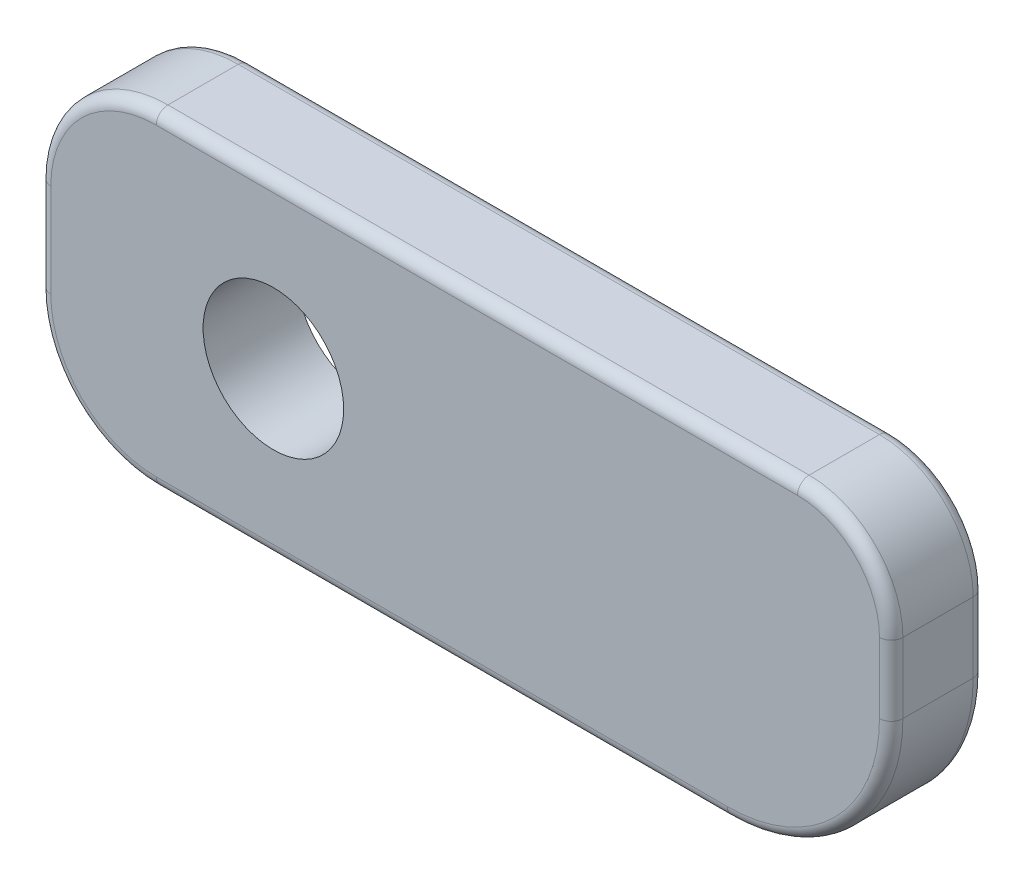
ISO-10303-21;
HEADER;
FILE_DESCRIPTION(('STEP AP214'),'2;1');
FILE_NAME('part.step','',(''),(''),'','','');
FILE_SCHEMA(('AUTOMOTIVE_DESIGN { 1 0 10303 214 1 1 1 1 }'));
ENDSEC;
DATA;
#1=APPLICATION_CONTEXT('core data for automotive mechanical design processes');
#2=APPLICATION_PROTOCOL_DEFINITION('international standard','automotive_design',2000,#1);
#3=PRODUCT_CONTEXT('',#1,'mechanical');
#4=PRODUCT('Part','Part','',(#3));
#5=PRODUCT_RELATED_PRODUCT_CATEGORY('part','',(#4));
#6=PRODUCT_DEFINITION_FORMATION('','',#4);
#7=PRODUCT_DEFINITION_CONTEXT('part definition',#1,'design');
#8=PRODUCT_DEFINITION('design','',#6,#7);
#9=PRODUCT_DEFINITION_SHAPE('','',#8);
#10=(LENGTH_UNIT() NAMED_UNIT(*) SI_UNIT(.MILLI.,.METRE.));
#11=(NAMED_UNIT(*) PLANE_ANGLE_UNIT() SI_UNIT($,.RADIAN.));
#12=(NAMED_UNIT(*) SI_UNIT($,.STERADIAN.) SOLID_ANGLE_UNIT());
#13=UNCERTAINTY_MEASURE_WITH_UNIT(LENGTH_MEASURE(1.E-05),#10,'distance_accuracy_value','');
#14=(GEOMETRIC_REPRESENTATION_CONTEXT(3) GLOBAL_UNCERTAINTY_ASSIGNED_CONTEXT((#13)) GLOBAL_UNIT_ASSIGNED_CONTEXT((#10,
#11,#12)) REPRESENTATION_CONTEXT('',''));
#15=CARTESIAN_POINT('',(0.,0.,0.));
#16=DIRECTION('',(0.,0.,1.));
#17=DIRECTION('',(1.,0.,0.));
#18=AXIS2_PLACEMENT_3D('',#15,#16,#17);
#19=CARTESIAN_POINT('',(0.,0.,10.16));
#20=DIRECTION('',(0.,0.,-1.));
#21=DIRECTION('',(-1.,0.,0.));
#22=AXIS2_PLACEMENT_3D('',#19,#20,#21);
#23=PLANE('',#22);
#24=CARTESIAN_POINT('',(25.4,17.78,10.16));
#25=DIRECTION('',(0.,0.,1.));
#26=DIRECTION('',(1.,0.,0.));
#27=AXIS2_PLACEMENT_3D('',#24,#25,#26);
#28=CIRCLE('',#27,7.62);
#29=CARTESIAN_POINT('',(33.02,17.78,10.16));
#30=VERTEX_POINT('',#29);
#31=EDGE_CURVE('E343',#30,#30,#28,.T.);
#32=ORIENTED_EDGE('',*,*,#31,.F.);
#33=EDGE_LOOP('',(#32));
#34=FACE_BOUND('',#33,.T.);
#35=CARTESIAN_POINT('',(12.7,12.7,10.16));
#36=DIRECTION('',(0.,0.,-1.));
#37=DIRECTION('',(-1.,0.,0.));
#38=AXIS2_PLACEMENT_3D('',#35,#36,#37);
#39=CIRCLE('',#38,11.43);
#40=CARTESIAN_POINT('',(12.7,1.27,10.16));
#41=VERTEX_POINT('',#40);
#42=CARTESIAN_POINT('',(1.27,12.7,10.16));
#43=VERTEX_POINT('',#42);
#44=EDGE_CURVE('E264',#41,#43,#39,.T.);
#45=ORIENTED_EDGE('',*,*,#44,.F.);
#46=DIRECTION('',(1.,0.,0.));
#47=VECTOR('',#46,1.);
#48=CARTESIAN_POINT('',(0.,1.27,10.16));
#49=LINE('',#48,#47);
#50=CARTESIAN_POINT('',(74.5998,1.27,10.16));
#51=VERTEX_POINT('',#50);
#52=EDGE_CURVE('E294',#41,#51,#49,.T.);
#53=ORIENTED_EDGE('',*,*,#52,.T.);
#54=CARTESIAN_POINT('',(74.5998,17.78,10.16));
#55=DIRECTION('',(0.,0.,-1.));
#56=DIRECTION('',(-1.,0.,0.));
#57=AXIS2_PLACEMENT_3D('',#54,#55,#56);
#58=CIRCLE('',#57,16.51);
#59=CARTESIAN_POINT('',(91.1098,17.78,10.16));
#60=VERTEX_POINT('',#59);
#61=EDGE_CURVE('E179',#60,#51,#58,.T.);
#62=ORIENTED_EDGE('',*,*,#61,.F.);
#63=DIRECTION('',(0.,1.,0.));
#64=VECTOR('',#63,1.);
#65=CARTESIAN_POINT('',(91.1098,0.,10.16));
#66=LINE('',#65,#64);
#67=CARTESIAN_POINT('',(91.1098,25.4,10.16));
#68=VERTEX_POINT('',#67);
#69=EDGE_CURVE('E298',#60,#68,#66,.T.);
#70=ORIENTED_EDGE('',*,*,#69,.T.);
#71=CARTESIAN_POINT('',(82.2198,25.4,10.16));
#72=DIRECTION('',(0.,0.,-1.));
#73=DIRECTION('',(-1.,0.,0.));
#74=AXIS2_PLACEMENT_3D('',#71,#72,#73);
#75=CIRCLE('',#74,8.89);
#76=CARTESIAN_POINT('',(82.2198,34.29,10.16));
#77=VERTEX_POINT('',#76);
#78=EDGE_CURVE('E216',#77,#68,#75,.T.);
#79=ORIENTED_EDGE('',*,*,#78,.F.);
#80=DIRECTION('',(-1.,0.,0.));
#81=VECTOR('',#80,1.);
#82=CARTESIAN_POINT('',(0.,34.29,10.16));
#83=LINE('',#82,#81);
#84=CARTESIAN_POINT('',(12.7,34.29,10.16));
#85=VERTEX_POINT('',#84);
#86=EDGE_CURVE('E340',#77,#85,#83,.T.);
#87=ORIENTED_EDGE('',*,*,#86,.T.);
#88=CARTESIAN_POINT('',(12.7,22.86,10.16));
#89=DIRECTION('',(0.,0.,-1.));
#90=DIRECTION('',(-1.,0.,0.));
#91=AXIS2_PLACEMENT_3D('',#88,#89,#90);
#92=CIRCLE('',#91,11.43);
#93=CARTESIAN_POINT('',(1.27,22.86,10.16));
#94=VERTEX_POINT('',#93);
#95=EDGE_CURVE('E242',#94,#85,#92,.T.);
#96=ORIENTED_EDGE('',*,*,#95,.F.);
#97=DIRECTION('',(0.,-1.,0.));
#98=VECTOR('',#97,1.);
#99=CARTESIAN_POINT('',(1.27,0.,10.16));
#100=LINE('',#99,#98);
#101=EDGE_CURVE('E289',#94,#43,#100,.T.);
#102=ORIENTED_EDGE('',*,*,#101,.T.);
#103=EDGE_LOOP('',(#45,#53,#62,#70,#79,#87,#96,#102));
#104=FACE_BOUND('',#103,.T.);
#105=ADVANCED_FACE('F38',(#34,#104),#23,.F.);
#106=CARTESIAN_POINT('',(0.,0.,0.));
#107=DIRECTION('',(0.,0.,-1.));
#108=DIRECTION('',(-1.,0.,0.));
#109=AXIS2_PLACEMENT_3D('',#106,#107,#108);
#110=PLANE('',#109);
#111=CARTESIAN_POINT('',(25.4,17.78,0.));
#112=DIRECTION('',(0.,0.,1.));
#113=DIRECTION('',(1.,0.,0.));
#114=AXIS2_PLACEMENT_3D('',#111,#112,#113);
#115=CIRCLE('',#114,7.62);
#116=CARTESIAN_POINT('',(33.02,17.78,0.));
#117=VERTEX_POINT('',#116);
#118=EDGE_CURVE('E210',#117,#117,#115,.T.);
#119=ORIENTED_EDGE('',*,*,#118,.T.);
#120=EDGE_LOOP('',(#119));
#121=FACE_BOUND('',#120,.T.);
#122=CARTESIAN_POINT('',(12.7,12.7,0.));
#123=DIRECTION('',(0.,0.,-1.));
#124=DIRECTION('',(-1.,0.,0.));
#125=AXIS2_PLACEMENT_3D('',#122,#123,#124);
#126=CIRCLE('',#125,11.43);
#127=CARTESIAN_POINT('',(1.27,12.7,0.));
#128=VERTEX_POINT('',#127);
#129=CARTESIAN_POINT('',(12.7,1.27,0.));
#130=VERTEX_POINT('',#129);
#131=EDGE_CURVE('E254',#128,#130,#126,.F.);
#132=ORIENTED_EDGE('',*,*,#131,.F.);
#133=DIRECTION('',(0.,-1.,0.));
#134=VECTOR('',#133,1.);
#135=CARTESIAN_POINT('',(1.27,35.56,0.));
#136=LINE('',#135,#134);
#137=CARTESIAN_POINT('',(1.27,22.86,0.));
#138=VERTEX_POINT('',#137);
#139=EDGE_CURVE('E308',#128,#138,#136,.F.);
#140=ORIENTED_EDGE('',*,*,#139,.T.);
#141=CARTESIAN_POINT('',(12.7,22.86,0.));
#142=DIRECTION('',(0.,0.,-1.));
#143=DIRECTION('',(-1.,0.,0.));
#144=AXIS2_PLACEMENT_3D('',#141,#142,#143);
#145=CIRCLE('',#144,11.43);
#146=CARTESIAN_POINT('',(12.7,34.29,0.));
#147=VERTEX_POINT('',#146);
#148=EDGE_CURVE('E237',#147,#138,#145,.F.);
#149=ORIENTED_EDGE('',*,*,#148,.F.);
#150=DIRECTION('',(-1.,0.,0.));
#151=VECTOR('',#150,1.);
#152=CARTESIAN_POINT('',(92.3798,34.29,0.));
#153=LINE('',#152,#151);
#154=CARTESIAN_POINT('',(82.2198,34.29,0.));
#155=VERTEX_POINT('',#154);
#156=EDGE_CURVE('E310',#147,#155,#153,.F.);
#157=ORIENTED_EDGE('',*,*,#156,.T.);
#158=CARTESIAN_POINT('',(82.2198,25.4,0.));
#159=DIRECTION('',(0.,0.,-1.));
#160=DIRECTION('',(-1.,0.,0.));
#161=AXIS2_PLACEMENT_3D('',#158,#159,#160);
#162=CIRCLE('',#161,8.89);
#163=CARTESIAN_POINT('',(91.1098,25.4,0.));
#164=VERTEX_POINT('',#163);
#165=EDGE_CURVE('E164',#164,#155,#162,.F.);
#166=ORIENTED_EDGE('',*,*,#165,.F.);
#167=DIRECTION('',(0.,1.,0.));
#168=VECTOR('',#167,1.);
#169=CARTESIAN_POINT('',(91.1098,0.,0.));
#170=LINE('',#169,#168);
#171=CARTESIAN_POINT('',(91.1098,17.78,0.));
#172=VERTEX_POINT('',#171);
#173=EDGE_CURVE('E155',#164,#172,#170,.F.);
#174=ORIENTED_EDGE('',*,*,#173,.T.);
#175=CARTESIAN_POINT('',(74.5998,17.78,0.));
#176=DIRECTION('',(0.,0.,-1.));
#177=DIRECTION('',(-1.,0.,0.));
#178=AXIS2_PLACEMENT_3D('',#175,#176,#177);
#179=CIRCLE('',#178,16.51);
#180=CARTESIAN_POINT('',(74.5998,1.27,0.));
#181=VERTEX_POINT('',#180);
#182=EDGE_CURVE('E161',#181,#172,#179,.F.);
#183=ORIENTED_EDGE('',*,*,#182,.F.);
#184=DIRECTION('',(1.,0.,0.));
#185=VECTOR('',#184,1.);
#186=CARTESIAN_POINT('',(0.,1.27,0.));
#187=LINE('',#186,#185);
#188=EDGE_CURVE('E168',#181,#130,#187,.F.);
#189=ORIENTED_EDGE('',*,*,#188,.T.);
#190=EDGE_LOOP('',(#132,#140,#149,#157,#166,#174,#183,#189));
#191=FACE_BOUND('',#190,.T.);
#192=ADVANCED_FACE('F158',(#121,#191),#110,.T.);
#193=CARTESIAN_POINT('',(92.3798,0.,10.16));
#194=DIRECTION('',(0.,1.,0.));
#195=DIRECTION('',(0.,0.,1.));
#196=AXIS2_PLACEMENT_3D('',#193,#194,#195);
#197=PLANE('',#196);
#198=DIRECTION('',(1.,0.,0.));
#199=VECTOR('',#198,1.);
#200=CARTESIAN_POINT('',(92.3798,0.,8.89));
#201=LINE('',#200,#199);
#202=CARTESIAN_POINT('',(74.5998,0.,8.89));
#203=VERTEX_POINT('',#202);
#204=CARTESIAN_POINT('',(12.7,0.,8.89));
#205=VERTEX_POINT('',#204);
#206=EDGE_CURVE('E296',#203,#205,#201,.F.);
#207=ORIENTED_EDGE('',*,*,#206,.T.);
#208=DIRECTION('',(0.,0.,-1.));
#209=VECTOR('',#208,1.);
#210=CARTESIAN_POINT('',(12.7,0.,10.16));
#211=LINE('',#210,#209);
#212=CARTESIAN_POINT('',(12.7,0.,1.27));
#213=VERTEX_POINT('',#212);
#214=EDGE_CURVE('E47',#205,#213,#211,.T.);
#215=ORIENTED_EDGE('',*,*,#214,.T.);
#216=DIRECTION('',(1.,0.,0.));
#217=VECTOR('',#216,1.);
#218=CARTESIAN_POINT('',(92.3798,0.,1.27));
#219=LINE('',#218,#217);
#220=CARTESIAN_POINT('',(74.5998,0.,1.27));
#221=VERTEX_POINT('',#220);
#222=EDGE_CURVE('E167',#213,#221,#219,.T.);
#223=ORIENTED_EDGE('',*,*,#222,.T.);
#224=DIRECTION('',(0.,0.,-1.));
#225=VECTOR('',#224,1.);
#226=CARTESIAN_POINT('',(74.5998,0.,10.16));
#227=LINE('',#226,#225);
#228=EDGE_CURVE('E201',#221,#203,#227,.F.);
#229=ORIENTED_EDGE('',*,*,#228,.T.);
#230=EDGE_LOOP('',(#207,#215,#223,#229));
#231=FACE_BOUND('',#230,.T.);
#232=ADVANCED_FACE('F370',(#231),#197,.F.);
#233=CARTESIAN_POINT('',(92.3798,35.56,10.16));
#234=DIRECTION('',(-1.,0.,0.));
#235=DIRECTION('',(0.,0.,1.));
#236=AXIS2_PLACEMENT_3D('',#233,#234,#235);
#237=PLANE('',#236);
#238=DIRECTION('',(0.,1.,0.));
#239=VECTOR('',#238,1.);
#240=CARTESIAN_POINT('',(92.3798,35.56,1.27));
#241=LINE('',#240,#239);
#242=CARTESIAN_POINT('',(92.3798,17.78,1.27));
#243=VERTEX_POINT('',#242);
#244=CARTESIAN_POINT('',(92.3798,25.4,1.27));
#245=VERTEX_POINT('',#244);
#246=EDGE_CURVE('E175',#243,#245,#241,.T.);
#247=ORIENTED_EDGE('',*,*,#246,.T.);
#248=DIRECTION('',(0.,0.,-1.));
#249=VECTOR('',#248,1.);
#250=CARTESIAN_POINT('',(92.3798,25.4,10.16));
#251=LINE('',#250,#249);
#252=CARTESIAN_POINT('',(92.3798,25.4,8.89));
#253=VERTEX_POINT('',#252);
#254=EDGE_CURVE('E226',#245,#253,#251,.F.);
#255=ORIENTED_EDGE('',*,*,#254,.T.);
#256=DIRECTION('',(0.,1.,0.));
#257=VECTOR('',#256,1.);
#258=CARTESIAN_POINT('',(92.3798,35.56,8.89));
#259=LINE('',#258,#257);
#260=CARTESIAN_POINT('',(92.3798,17.78,8.89));
#261=VERTEX_POINT('',#260);
#262=EDGE_CURVE('E303',#253,#261,#259,.F.);
#263=ORIENTED_EDGE('',*,*,#262,.T.);
#264=DIRECTION('',(0.,0.,-1.));
#265=VECTOR('',#264,1.);
#266=CARTESIAN_POINT('',(92.3798,17.78,10.16));
#267=LINE('',#266,#265);
#268=EDGE_CURVE('E199',#261,#243,#267,.T.);
#269=ORIENTED_EDGE('',*,*,#268,.T.);
#270=EDGE_LOOP('',(#247,#255,#263,#269));
#271=FACE_BOUND('',#270,.T.);
#272=ADVANCED_FACE('F376',(#271),#237,.F.);
#273=CARTESIAN_POINT('',(0.,35.56,10.16));
#274=DIRECTION('',(0.,-1.,0.));
#275=DIRECTION('',(0.,0.,-1.));
#276=AXIS2_PLACEMENT_3D('',#273,#274,#275);
#277=PLANE('',#276);
#278=DIRECTION('',(-1.,0.,0.));
#279=VECTOR('',#278,1.);
#280=CARTESIAN_POINT('',(0.,35.56,1.27));
#281=LINE('',#280,#279);
#282=CARTESIAN_POINT('',(82.2198,35.56,1.27));
#283=VERTEX_POINT('',#282);
#284=CARTESIAN_POINT('',(12.7,35.56,1.27));
#285=VERTEX_POINT('',#284);
#286=EDGE_CURVE('E186',#283,#285,#281,.T.);
#287=ORIENTED_EDGE('',*,*,#286,.T.);
#288=DIRECTION('',(0.,0.,-1.));
#289=VECTOR('',#288,1.);
#290=CARTESIAN_POINT('',(12.7,35.56,10.16));
#291=LINE('',#290,#289);
#292=CARTESIAN_POINT('',(12.7,35.56,8.89));
#293=VERTEX_POINT('',#292);
#294=EDGE_CURVE('E252',#285,#293,#291,.F.);
#295=ORIENTED_EDGE('',*,*,#294,.T.);
#296=DIRECTION('',(-1.,0.,0.));
#297=VECTOR('',#296,1.);
#298=CARTESIAN_POINT('',(0.,35.56,8.89));
#299=LINE('',#298,#297);
#300=CARTESIAN_POINT('',(82.2198,35.56,8.89));
#301=VERTEX_POINT('',#300);
#302=EDGE_CURVE('E305',#293,#301,#299,.F.);
#303=ORIENTED_EDGE('',*,*,#302,.T.);
#304=DIRECTION('',(0.,0.,-1.));
#305=VECTOR('',#304,1.);
#306=CARTESIAN_POINT('',(82.2198,35.56,10.16));
#307=LINE('',#306,#305);
#308=EDGE_CURVE('E224',#301,#283,#307,.T.);
#309=ORIENTED_EDGE('',*,*,#308,.T.);
#310=EDGE_LOOP('',(#287,#295,#303,#309));
#311=FACE_BOUND('',#310,.T.);
#312=ADVANCED_FACE('F317',(#311),#277,.F.);
#313=CARTESIAN_POINT('',(0.,0.,10.16));
#314=DIRECTION('',(1.,0.,0.));
#315=DIRECTION('',(0.,0.,-1.));
#316=AXIS2_PLACEMENT_3D('',#313,#314,#315);
#317=PLANE('',#316);
#318=DIRECTION('',(0.,-1.,0.));
#319=VECTOR('',#318,1.);
#320=CARTESIAN_POINT('',(0.,0.,1.27));
#321=LINE('',#320,#319);
#322=CARTESIAN_POINT('',(0.,22.86,1.27));
#323=VERTEX_POINT('',#322);
#324=CARTESIAN_POINT('',(0.,12.7,1.27));
#325=VERTEX_POINT('',#324);
#326=EDGE_CURVE('E184',#323,#325,#321,.T.);
#327=ORIENTED_EDGE('',*,*,#326,.T.);
#328=DIRECTION('',(0.,0.,-1.));
#329=VECTOR('',#328,1.);
#330=CARTESIAN_POINT('',(0.,12.7,10.16));
#331=LINE('',#330,#329);
#332=CARTESIAN_POINT('',(0.,12.7,8.89));
#333=VERTEX_POINT('',#332);
#334=EDGE_CURVE('E11',#325,#333,#331,.F.);
#335=ORIENTED_EDGE('',*,*,#334,.T.);
#336=DIRECTION('',(0.,-1.,0.));
#337=VECTOR('',#336,1.);
#338=CARTESIAN_POINT('',(0.,0.,8.89));
#339=LINE('',#338,#337);
#340=CARTESIAN_POINT('',(0.,22.86,8.89));
#341=VERTEX_POINT('',#340);
#342=EDGE_CURVE('E291',#333,#341,#339,.F.);
#343=ORIENTED_EDGE('',*,*,#342,.T.);
#344=DIRECTION('',(0.,0.,-1.));
#345=VECTOR('',#344,1.);
#346=CARTESIAN_POINT('',(0.,22.86,10.16));
#347=LINE('',#346,#345);
#348=EDGE_CURVE('E250',#341,#323,#347,.T.);
#349=ORIENTED_EDGE('',*,*,#348,.T.);
#350=EDGE_LOOP('',(#327,#335,#343,#349));
#351=FACE_BOUND('',#350,.T.);
#352=ADVANCED_FACE('F333',(#351),#317,.F.);
#353=CARTESIAN_POINT('',(25.4,17.78,10.16));
#354=DIRECTION('',(0.,0.,-1.));
#355=DIRECTION('',(-1.,0.,0.));
#356=AXIS2_PLACEMENT_3D('',#353,#354,#355);
#357=CYLINDRICAL_SURFACE('',#356,7.62);
#358=ORIENTED_EDGE('',*,*,#31,.T.);
#359=EDGE_LOOP('',(#358));
#360=FACE_BOUND('',#359,.T.);
#361=ORIENTED_EDGE('',*,*,#118,.F.);
#362=EDGE_LOOP('',(#361));
#363=FACE_BOUND('',#362,.T.);
#364=ADVANCED_FACE('F352',(#360,#363),#357,.F.);
#365=CARTESIAN_POINT('',(91.1098,0.,8.89));
#366=DIRECTION('',(0.,1.,0.));
#367=DIRECTION('',(0.,0.,1.));
#368=AXIS2_PLACEMENT_3D('',#365,#366,#367);
#369=CYLINDRICAL_SURFACE('',#368,1.27);
#370=ORIENTED_EDGE('',*,*,#262,.F.);
#371=CARTESIAN_POINT('',(91.1098,25.4,8.89));
#372=DIRECTION('',(0.,-1.,0.));
#373=DIRECTION('',(0.,0.,-1.));
#374=AXIS2_PLACEMENT_3D('',#371,#372,#373);
#375=CIRCLE('',#374,1.27);
#376=EDGE_CURVE('E214',#253,#68,#375,.T.);
#377=ORIENTED_EDGE('',*,*,#376,.T.);
#378=ORIENTED_EDGE('',*,*,#69,.F.);
#379=CARTESIAN_POINT('',(91.1098,17.78,8.89));
#380=DIRECTION('',(0.,1.,0.));
#381=DIRECTION('',(0.,0.,1.));
#382=AXIS2_PLACEMENT_3D('',#379,#380,#381);
#383=CIRCLE('',#382,1.27);
#384=EDGE_CURVE('E195',#60,#261,#383,.T.);
#385=ORIENTED_EDGE('',*,*,#384,.T.);
#386=EDGE_LOOP('',(#370,#377,#378,#385));
#387=FACE_BOUND('',#386,.T.);
#388=ADVANCED_FACE('F354',(#387),#369,.T.);
#389=CARTESIAN_POINT('',(0.,34.29,8.89));
#390=DIRECTION('',(-1.,0.,0.));
#391=DIRECTION('',(0.,0.,1.));
#392=AXIS2_PLACEMENT_3D('',#389,#390,#391);
#393=CYLINDRICAL_SURFACE('',#392,1.27);
#394=ORIENTED_EDGE('',*,*,#302,.F.);
#395=CARTESIAN_POINT('',(12.7,34.29,8.89));
#396=DIRECTION('',(1.,0.,0.));
#397=DIRECTION('',(0.,0.,-1.));
#398=AXIS2_PLACEMENT_3D('',#395,#396,#397);
#399=CIRCLE('',#398,1.27);
#400=EDGE_CURVE('E240',#293,#85,#399,.T.);
#401=ORIENTED_EDGE('',*,*,#400,.T.);
#402=ORIENTED_EDGE('',*,*,#86,.F.);
#403=CARTESIAN_POINT('',(82.2198,34.29,8.89));
#404=DIRECTION('',(-1.,0.,0.));
#405=DIRECTION('',(0.,0.,1.));
#406=AXIS2_PLACEMENT_3D('',#403,#404,#405);
#407=CIRCLE('',#406,1.27);
#408=EDGE_CURVE('E219',#77,#301,#407,.T.);
#409=ORIENTED_EDGE('',*,*,#408,.T.);
#410=EDGE_LOOP('',(#394,#401,#402,#409));
#411=FACE_BOUND('',#410,.T.);
#412=ADVANCED_FACE('F339',(#411),#393,.T.);
#413=CARTESIAN_POINT('',(0.,1.27,8.89));
#414=DIRECTION('',(1.,0.,0.));
#415=DIRECTION('',(0.,0.,-1.));
#416=AXIS2_PLACEMENT_3D('',#413,#414,#415);
#417=CYLINDRICAL_SURFACE('',#416,1.27);
#418=ORIENTED_EDGE('',*,*,#52,.F.);
#419=CARTESIAN_POINT('',(12.7,1.27,8.89));
#420=DIRECTION('',(1.,0.,0.));
#421=DIRECTION('',(0.,0.,-1.));
#422=AXIS2_PLACEMENT_3D('',#419,#420,#421);
#423=CIRCLE('',#422,1.27);
#424=EDGE_CURVE('E63',#41,#205,#423,.T.);
#425=ORIENTED_EDGE('',*,*,#424,.T.);
#426=ORIENTED_EDGE('',*,*,#206,.F.);
#427=CARTESIAN_POINT('',(74.5998,1.27,8.89));
#428=DIRECTION('',(-1.,0.,0.));
#429=DIRECTION('',(0.,0.,1.));
#430=AXIS2_PLACEMENT_3D('',#427,#428,#429);
#431=CIRCLE('',#430,1.27);
#432=EDGE_CURVE('E192',#203,#51,#431,.T.);
#433=ORIENTED_EDGE('',*,*,#432,.T.);
#434=EDGE_LOOP('',(#418,#425,#426,#433));
#435=FACE_BOUND('',#434,.T.);
#436=ADVANCED_FACE('F385',(#435),#417,.T.);
#437=CARTESIAN_POINT('',(1.27,0.,8.89));
#438=DIRECTION('',(0.,-1.,0.));
#439=DIRECTION('',(0.,0.,-1.));
#440=AXIS2_PLACEMENT_3D('',#437,#438,#439);
#441=CYLINDRICAL_SURFACE('',#440,1.27);
#442=ORIENTED_EDGE('',*,*,#342,.F.);
#443=CARTESIAN_POINT('',(1.27,12.7,8.89));
#444=DIRECTION('',(0.,1.,0.));
#445=DIRECTION('',(0.,0.,1.));
#446=AXIS2_PLACEMENT_3D('',#443,#444,#445);
#447=CIRCLE('',#446,1.27);
#448=EDGE_CURVE('E267',#333,#43,#447,.T.);
#449=ORIENTED_EDGE('',*,*,#448,.T.);
#450=ORIENTED_EDGE('',*,*,#101,.F.);
#451=CARTESIAN_POINT('',(1.27,22.86,8.89));
#452=DIRECTION('',(0.,-1.,0.));
#453=DIRECTION('',(0.,0.,-1.));
#454=AXIS2_PLACEMENT_3D('',#451,#452,#453);
#455=CIRCLE('',#454,1.27);
#456=EDGE_CURVE('E245',#94,#341,#455,.T.);
#457=ORIENTED_EDGE('',*,*,#456,.T.);
#458=EDGE_LOOP('',(#442,#449,#450,#457));
#459=FACE_BOUND('',#458,.T.);
#460=ADVANCED_FACE('F288',(#459),#441,.T.);
#461=CARTESIAN_POINT('',(1.27,0.,1.27));
#462=DIRECTION('',(0.,1.,0.));
#463=DIRECTION('',(0.,0.,1.));
#464=AXIS2_PLACEMENT_3D('',#461,#462,#463);
#465=CYLINDRICAL_SURFACE('',#464,1.27);
#466=ORIENTED_EDGE('',*,*,#139,.F.);
#467=CARTESIAN_POINT('',(1.27,12.7,1.27));
#468=DIRECTION('',(0.,1.,0.));
#469=DIRECTION('',(0.,0.,1.));
#470=AXIS2_PLACEMENT_3D('',#467,#468,#469);
#471=CIRCLE('',#470,1.27);
#472=EDGE_CURVE('E55',#128,#325,#471,.T.);
#473=ORIENTED_EDGE('',*,*,#472,.T.);
#474=ORIENTED_EDGE('',*,*,#326,.F.);
#475=CARTESIAN_POINT('',(1.27,22.86,1.27));
#476=DIRECTION('',(0.,-1.,0.));
#477=DIRECTION('',(0.,0.,-1.));
#478=AXIS2_PLACEMENT_3D('',#475,#476,#477);
#479=CIRCLE('',#478,1.27);
#480=EDGE_CURVE('E228',#323,#138,#479,.T.);
#481=ORIENTED_EDGE('',*,*,#480,.T.);
#482=EDGE_LOOP('',(#466,#473,#474,#481));
#483=FACE_BOUND('',#482,.T.);
#484=ADVANCED_FACE('F331',(#483),#465,.T.);
#485=CARTESIAN_POINT('',(92.3798,1.27,1.27));
#486=DIRECTION('',(-1.,0.,0.));
#487=DIRECTION('',(0.,0.,1.));
#488=AXIS2_PLACEMENT_3D('',#485,#486,#487);
#489=CYLINDRICAL_SURFACE('',#488,1.27);
#490=ORIENTED_EDGE('',*,*,#222,.F.);
#491=CARTESIAN_POINT('',(12.7,1.27,1.27));
#492=DIRECTION('',(1.,0.,0.));
#493=DIRECTION('',(0.,0.,-1.));
#494=AXIS2_PLACEMENT_3D('',#491,#492,#493);
#495=CIRCLE('',#494,1.27);
#496=EDGE_CURVE('E262',#213,#130,#495,.T.);
#497=ORIENTED_EDGE('',*,*,#496,.T.);
#498=ORIENTED_EDGE('',*,*,#188,.F.);
#499=CARTESIAN_POINT('',(74.5998,1.27,1.27));
#500=DIRECTION('',(-1.,0.,0.));
#501=DIRECTION('',(0.,0.,1.));
#502=AXIS2_PLACEMENT_3D('',#499,#500,#501);
#503=CIRCLE('',#502,1.27);
#504=EDGE_CURVE('E183',#181,#221,#503,.T.);
#505=ORIENTED_EDGE('',*,*,#504,.T.);
#506=EDGE_LOOP('',(#490,#497,#498,#505));
#507=FACE_BOUND('',#506,.T.);
#508=ADVANCED_FACE('F396',(#507),#489,.T.);
#509=CARTESIAN_POINT('',(0.,34.29,1.27));
#510=DIRECTION('',(1.,0.,0.));
#511=DIRECTION('',(0.,0.,-1.));
#512=AXIS2_PLACEMENT_3D('',#509,#510,#511);
#513=CYLINDRICAL_SURFACE('',#512,1.27);
#514=ORIENTED_EDGE('',*,*,#156,.F.);
#515=CARTESIAN_POINT('',(12.7,34.29,1.27));
#516=DIRECTION('',(1.,0.,0.));
#517=DIRECTION('',(0.,0.,-1.));
#518=AXIS2_PLACEMENT_3D('',#515,#516,#517);
#519=CIRCLE('',#518,1.27);
#520=EDGE_CURVE('E248',#147,#285,#519,.T.);
#521=ORIENTED_EDGE('',*,*,#520,.T.);
#522=ORIENTED_EDGE('',*,*,#286,.F.);
#523=CARTESIAN_POINT('',(82.2198,34.29,1.27));
#524=DIRECTION('',(-1.,0.,0.));
#525=DIRECTION('',(0.,0.,1.));
#526=AXIS2_PLACEMENT_3D('',#523,#524,#525);
#527=CIRCLE('',#526,1.27);
#528=EDGE_CURVE('E203',#283,#155,#527,.T.);
#529=ORIENTED_EDGE('',*,*,#528,.T.);
#530=EDGE_LOOP('',(#514,#521,#522,#529));
#531=FACE_BOUND('',#530,.T.);
#532=ADVANCED_FACE('F393',(#531),#513,.T.);
#533=CARTESIAN_POINT('',(91.1098,35.56,1.27));
#534=DIRECTION('',(0.,-1.,0.));
#535=DIRECTION('',(0.,0.,-1.));
#536=AXIS2_PLACEMENT_3D('',#533,#534,#535);
#537=CYLINDRICAL_SURFACE('',#536,1.27);
#538=ORIENTED_EDGE('',*,*,#173,.F.);
#539=CARTESIAN_POINT('',(91.1098,25.4,1.27));
#540=DIRECTION('',(0.,-1.,0.));
#541=DIRECTION('',(0.,0.,-1.));
#542=AXIS2_PLACEMENT_3D('',#539,#540,#541);
#543=CIRCLE('',#542,1.27);
#544=EDGE_CURVE('E222',#164,#245,#543,.T.);
#545=ORIENTED_EDGE('',*,*,#544,.T.);
#546=ORIENTED_EDGE('',*,*,#246,.F.);
#547=CARTESIAN_POINT('',(91.1098,17.78,1.27));
#548=DIRECTION('',(0.,1.,0.));
#549=DIRECTION('',(0.,0.,1.));
#550=AXIS2_PLACEMENT_3D('',#547,#548,#549);
#551=CIRCLE('',#550,1.27);
#552=EDGE_CURVE('E172',#243,#172,#551,.T.);
#553=ORIENTED_EDGE('',*,*,#552,.T.);
#554=EDGE_LOOP('',(#538,#545,#546,#553));
#555=FACE_BOUND('',#554,.T.);
#556=ADVANCED_FACE('F173',(#555),#537,.T.);
#557=CARTESIAN_POINT('',(74.5998,17.78,8.89));
#558=DIRECTION('',(0.,0.,-1.));
#559=DIRECTION('',(-1.,0.,0.));
#560=AXIS2_PLACEMENT_3D('',#557,#558,#559);
#561=TOROIDAL_SURFACE('',#560,16.51,1.27);
#562=ORIENTED_EDGE('',*,*,#61,.T.);
#563=ORIENTED_EDGE('',*,*,#432,.F.);
#564=CARTESIAN_POINT('',(74.5998,17.78,8.89));
#565=DIRECTION('',(0.,0.,-1.));
#566=DIRECTION('',(-1.,0.,0.));
#567=AXIS2_PLACEMENT_3D('',#564,#565,#566);
#568=CIRCLE('',#567,17.78);
#569=EDGE_CURVE('E206',#261,#203,#568,.T.);
#570=ORIENTED_EDGE('',*,*,#569,.F.);
#571=ORIENTED_EDGE('',*,*,#384,.F.);
#572=EDGE_LOOP('',(#562,#563,#570,#571));
#573=FACE_BOUND('',#572,.T.);
#574=ADVANCED_FACE('F392',(#573),#561,.T.);
#575=CARTESIAN_POINT('',(74.5998,17.78,10.16));
#576=DIRECTION('',(0.,0.,-1.));
#577=DIRECTION('',(-1.,0.,0.));
#578=AXIS2_PLACEMENT_3D('',#575,#576,#577);
#579=CYLINDRICAL_SURFACE('',#578,17.78);
#580=ORIENTED_EDGE('',*,*,#569,.T.);
#581=ORIENTED_EDGE('',*,*,#228,.F.);
#582=CARTESIAN_POINT('',(74.5998,17.78,1.27));
#583=DIRECTION('',(0.,0.,-1.));
#584=DIRECTION('',(-1.,0.,0.));
#585=AXIS2_PLACEMENT_3D('',#582,#583,#584);
#586=CIRCLE('',#585,17.78);
#587=EDGE_CURVE('E204',#243,#221,#586,.T.);
#588=ORIENTED_EDGE('',*,*,#587,.F.);
#589=ORIENTED_EDGE('',*,*,#268,.F.);
#590=EDGE_LOOP('',(#580,#581,#588,#589));
#591=FACE_BOUND('',#590,.T.);
#592=ADVANCED_FACE('F405',(#591),#579,.T.);
#593=CARTESIAN_POINT('',(74.5998,17.78,1.27));
#594=DIRECTION('',(0.,0.,-1.));
#595=DIRECTION('',(-1.,0.,0.));
#596=AXIS2_PLACEMENT_3D('',#593,#594,#595);
#597=TOROIDAL_SURFACE('',#596,16.51,1.27);
#598=ORIENTED_EDGE('',*,*,#504,.F.);
#599=ORIENTED_EDGE('',*,*,#182,.T.);
#600=ORIENTED_EDGE('',*,*,#552,.F.);
#601=ORIENTED_EDGE('',*,*,#587,.T.);
#602=EDGE_LOOP('',(#598,#599,#600,#601));
#603=FACE_BOUND('',#602,.T.);
#604=ADVANCED_FACE('F181',(#603),#597,.T.);
#605=CARTESIAN_POINT('',(82.2198,25.4,8.89));
#606=DIRECTION('',(0.,0.,-1.));
#607=DIRECTION('',(-1.,0.,0.));
#608=AXIS2_PLACEMENT_3D('',#605,#606,#607);
#609=TOROIDAL_SURFACE('',#608,8.89,1.27);
#610=ORIENTED_EDGE('',*,*,#78,.T.);
#611=ORIENTED_EDGE('',*,*,#376,.F.);
#612=CARTESIAN_POINT('',(82.2198,25.4,8.89));
#613=DIRECTION('',(0.,0.,-1.));
#614=DIRECTION('',(-1.,0.,0.));
#615=AXIS2_PLACEMENT_3D('',#612,#613,#614);
#616=CIRCLE('',#615,10.16);
#617=EDGE_CURVE('E207',#301,#253,#616,.T.);
#618=ORIENTED_EDGE('',*,*,#617,.F.);
#619=ORIENTED_EDGE('',*,*,#408,.F.);
#620=EDGE_LOOP('',(#610,#611,#618,#619));
#621=FACE_BOUND('',#620,.T.);
#622=ADVANCED_FACE('F404',(#621),#609,.T.);
#623=CARTESIAN_POINT('',(82.2198,25.4,10.16));
#624=DIRECTION('',(0.,0.,-1.));
#625=DIRECTION('',(-1.,0.,0.));
#626=AXIS2_PLACEMENT_3D('',#623,#624,#625);
#627=CYLINDRICAL_SURFACE('',#626,10.16);
#628=ORIENTED_EDGE('',*,*,#617,.T.);
#629=ORIENTED_EDGE('',*,*,#254,.F.);
#630=CARTESIAN_POINT('',(82.2198,25.4,1.27));
#631=DIRECTION('',(0.,0.,-1.));
#632=DIRECTION('',(-1.,0.,0.));
#633=AXIS2_PLACEMENT_3D('',#630,#631,#632);
#634=CIRCLE('',#633,10.16);
#635=EDGE_CURVE('E229',#283,#245,#634,.T.);
#636=ORIENTED_EDGE('',*,*,#635,.F.);
#637=ORIENTED_EDGE('',*,*,#308,.F.);
#638=EDGE_LOOP('',(#628,#629,#636,#637));
#639=FACE_BOUND('',#638,.T.);
#640=ADVANCED_FACE('F415',(#639),#627,.T.);
#641=CARTESIAN_POINT('',(82.2198,25.4,1.27));
#642=DIRECTION('',(0.,0.,-1.));
#643=DIRECTION('',(-1.,0.,0.));
#644=AXIS2_PLACEMENT_3D('',#641,#642,#643);
#645=TOROIDAL_SURFACE('',#644,8.89,1.27);
#646=ORIENTED_EDGE('',*,*,#528,.F.);
#647=ORIENTED_EDGE('',*,*,#635,.T.);
#648=ORIENTED_EDGE('',*,*,#544,.F.);
#649=ORIENTED_EDGE('',*,*,#165,.T.);
#650=EDGE_LOOP('',(#646,#647,#648,#649));
#651=FACE_BOUND('',#650,.T.);
#652=ADVANCED_FACE('F412',(#651),#645,.T.);
#653=CARTESIAN_POINT('',(12.7,22.86,8.89));
#654=DIRECTION('',(0.,0.,-1.));
#655=DIRECTION('',(-1.,0.,0.));
#656=AXIS2_PLACEMENT_3D('',#653,#654,#655);
#657=TOROIDAL_SURFACE('',#656,11.43,1.27);
#658=ORIENTED_EDGE('',*,*,#95,.T.);
#659=ORIENTED_EDGE('',*,*,#400,.F.);
#660=CARTESIAN_POINT('',(12.7,22.86,8.89));
#661=DIRECTION('',(0.,0.,-1.));
#662=DIRECTION('',(-1.,0.,0.));
#663=AXIS2_PLACEMENT_3D('',#660,#661,#662);
#664=CIRCLE('',#663,12.7);
#665=EDGE_CURVE('E232',#341,#293,#664,.T.);
#666=ORIENTED_EDGE('',*,*,#665,.F.);
#667=ORIENTED_EDGE('',*,*,#456,.F.);
#668=EDGE_LOOP('',(#658,#659,#666,#667));
#669=FACE_BOUND('',#668,.T.);
#670=ADVANCED_FACE('F336',(#669),#657,.T.);
#671=CARTESIAN_POINT('',(12.7,22.86,10.16));
#672=DIRECTION('',(0.,0.,-1.));
#673=DIRECTION('',(-1.,0.,0.));
#674=AXIS2_PLACEMENT_3D('',#671,#672,#673);
#675=CYLINDRICAL_SURFACE('',#674,12.7);
#676=ORIENTED_EDGE('',*,*,#665,.T.);
#677=ORIENTED_EDGE('',*,*,#294,.F.);
#678=CARTESIAN_POINT('',(12.7,22.86,1.27));
#679=DIRECTION('',(0.,0.,-1.));
#680=DIRECTION('',(-1.,0.,0.));
#681=AXIS2_PLACEMENT_3D('',#678,#679,#680);
#682=CIRCLE('',#681,12.7);
#683=EDGE_CURVE('E255',#323,#285,#682,.T.);
#684=ORIENTED_EDGE('',*,*,#683,.F.);
#685=ORIENTED_EDGE('',*,*,#348,.F.);
#686=EDGE_LOOP('',(#676,#677,#684,#685));
#687=FACE_BOUND('',#686,.T.);
#688=ADVANCED_FACE('F324',(#687),#675,.T.);
#689=CARTESIAN_POINT('',(12.7,22.86,1.27));
#690=DIRECTION('',(0.,0.,-1.));
#691=DIRECTION('',(-1.,0.,0.));
#692=AXIS2_PLACEMENT_3D('',#689,#690,#691);
#693=TOROIDAL_SURFACE('',#692,11.43,1.27);
#694=ORIENTED_EDGE('',*,*,#480,.F.);
#695=ORIENTED_EDGE('',*,*,#683,.T.);
#696=ORIENTED_EDGE('',*,*,#520,.F.);
#697=ORIENTED_EDGE('',*,*,#148,.T.);
#698=EDGE_LOOP('',(#694,#695,#696,#697));
#699=FACE_BOUND('',#698,.T.);
#700=ADVANCED_FACE('F330',(#699),#693,.T.);
#701=CARTESIAN_POINT('',(12.7,12.7,8.89));
#702=DIRECTION('',(0.,0.,-1.));
#703=DIRECTION('',(-1.,0.,0.));
#704=AXIS2_PLACEMENT_3D('',#701,#702,#703);
#705=TOROIDAL_SURFACE('',#704,11.43,1.27);
#706=ORIENTED_EDGE('',*,*,#44,.T.);
#707=ORIENTED_EDGE('',*,*,#448,.F.);
#708=CARTESIAN_POINT('',(12.7,12.7,8.89));
#709=DIRECTION('',(0.,0.,-1.));
#710=DIRECTION('',(-1.,0.,0.));
#711=AXIS2_PLACEMENT_3D('',#708,#709,#710);
#712=CIRCLE('',#711,12.7);
#713=EDGE_CURVE('E42',#205,#333,#712,.T.);
#714=ORIENTED_EDGE('',*,*,#713,.F.);
#715=ORIENTED_EDGE('',*,*,#424,.F.);
#716=EDGE_LOOP('',(#706,#707,#714,#715));
#717=FACE_BOUND('',#716,.T.);
#718=ADVANCED_FACE('F40',(#717),#705,.T.);
#719=CARTESIAN_POINT('',(12.7,12.7,10.16));
#720=DIRECTION('',(0.,0.,-1.));
#721=DIRECTION('',(-1.,0.,0.));
#722=AXIS2_PLACEMENT_3D('',#719,#720,#721);
#723=CYLINDRICAL_SURFACE('',#722,12.7);
#724=ORIENTED_EDGE('',*,*,#713,.T.);
#725=ORIENTED_EDGE('',*,*,#334,.F.);
#726=CARTESIAN_POINT('',(12.7,12.7,1.27));
#727=DIRECTION('',(0.,0.,-1.));
#728=DIRECTION('',(-1.,0.,0.));
#729=AXIS2_PLACEMENT_3D('',#726,#727,#728);
#730=CIRCLE('',#729,12.7);
#731=EDGE_CURVE('E271',#213,#325,#730,.T.);
#732=ORIENTED_EDGE('',*,*,#731,.F.);
#733=ORIENTED_EDGE('',*,*,#214,.F.);
#734=EDGE_LOOP('',(#724,#725,#732,#733));
#735=FACE_BOUND('',#734,.T.);
#736=ADVANCED_FACE('F281',(#735),#723,.T.);
#737=CARTESIAN_POINT('',(12.7,12.7,1.27));
#738=DIRECTION('',(0.,0.,-1.));
#739=DIRECTION('',(-1.,0.,0.));
#740=AXIS2_PLACEMENT_3D('',#737,#738,#739);
#741=TOROIDAL_SURFACE('',#740,11.43,1.27);
#742=ORIENTED_EDGE('',*,*,#472,.F.);
#743=ORIENTED_EDGE('',*,*,#131,.T.);
#744=ORIENTED_EDGE('',*,*,#496,.F.);
#745=ORIENTED_EDGE('',*,*,#731,.T.);
#746=EDGE_LOOP('',(#742,#743,#744,#745));
#747=FACE_BOUND('',#746,.T.);
#748=ADVANCED_FACE('F429',(#747),#741,.T.);
#749=CLOSED_SHELL('',(#105,#192,#232,#272,#312,#352,#364,#388,#412,#436,#460,#484,#508,#532,
#556,#574,#592,#604,#622,#640,#652,#670,#688,#700,#718,#736,#748));
#750=MANIFOLD_SOLID_BREP('B2',#749);
#751=ADVANCED_BREP_SHAPE_REPRESENTATION('',(#18,#750),#14);
#752=SHAPE_DEFINITION_REPRESENTATION(#9,#751);
ENDSEC;
END-ISO-10303-21;
